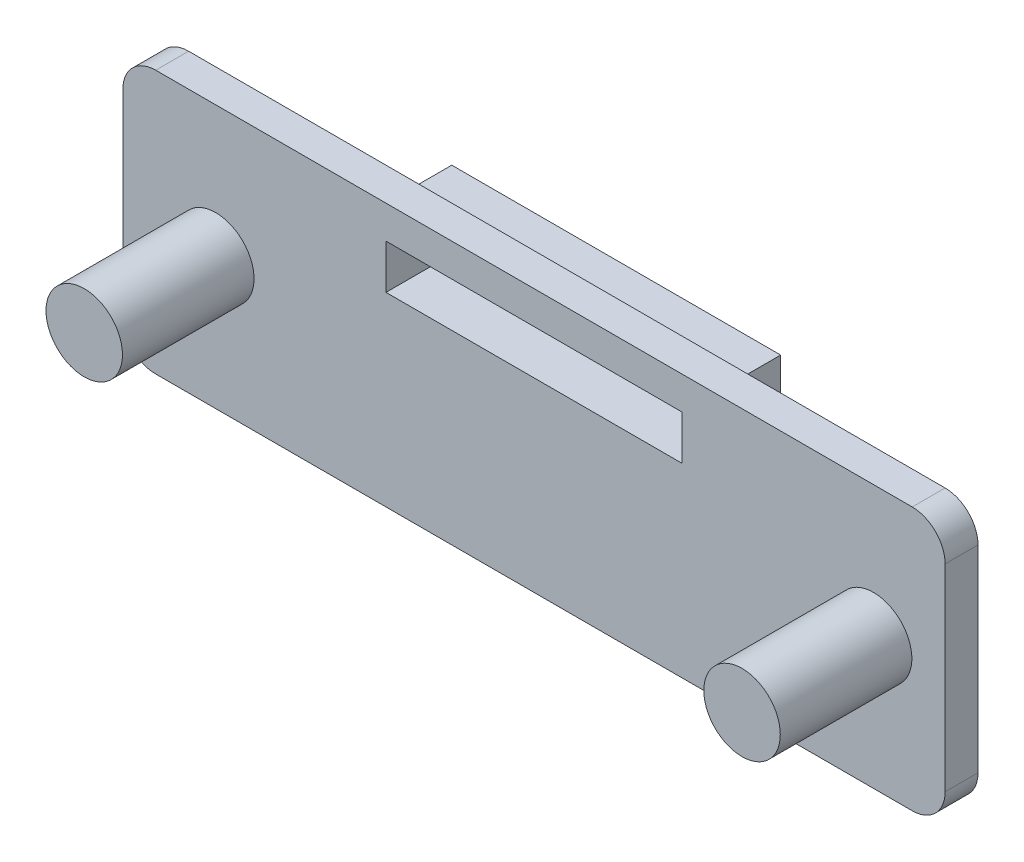
ISO-10303-21;
HEADER;
FILE_DESCRIPTION(('STEP AP214'),'2;1');
FILE_NAME('part.step','',(''),(''),'','','');
FILE_SCHEMA(('AUTOMOTIVE_DESIGN { 1 0 10303 214 1 1 1 1 }'));
ENDSEC;
DATA;
#1=APPLICATION_CONTEXT('core data for automotive mechanical design processes');
#2=APPLICATION_PROTOCOL_DEFINITION('international standard','automotive_design',2000,#1);
#3=PRODUCT_CONTEXT('',#1,'mechanical');
#4=PRODUCT('Part','Part','',(#3));
#5=PRODUCT_RELATED_PRODUCT_CATEGORY('part','',(#4));
#6=PRODUCT_DEFINITION_FORMATION('','',#4);
#7=PRODUCT_DEFINITION_CONTEXT('part definition',#1,'design');
#8=PRODUCT_DEFINITION('design','',#6,#7);
#9=PRODUCT_DEFINITION_SHAPE('','',#8);
#10=(LENGTH_UNIT() NAMED_UNIT(*) SI_UNIT(.MILLI.,.METRE.));
#11=(NAMED_UNIT(*) PLANE_ANGLE_UNIT() SI_UNIT($,.RADIAN.));
#12=(NAMED_UNIT(*) SI_UNIT($,.STERADIAN.) SOLID_ANGLE_UNIT());
#13=UNCERTAINTY_MEASURE_WITH_UNIT(LENGTH_MEASURE(1.E-05),#10,'distance_accuracy_value','');
#14=(GEOMETRIC_REPRESENTATION_CONTEXT(3) GLOBAL_UNCERTAINTY_ASSIGNED_CONTEXT((#13)) GLOBAL_UNIT_ASSIGNED_CONTEXT((#10,
#11,#12)) REPRESENTATION_CONTEXT('',''));
#15=CARTESIAN_POINT('',(0.,0.,0.));
#16=DIRECTION('',(0.,0.,1.));
#17=DIRECTION('',(1.,0.,0.));
#18=AXIS2_PLACEMENT_3D('',#15,#16,#17);
#19=CARTESIAN_POINT('',(19.6730582498255,18.1725691609462,2.));
#20=DIRECTION('',(-1.,0.,0.));
#21=DIRECTION('',(0.,-1.,0.));
#22=AXIS2_PLACEMENT_3D('',#19,#20,#21);
#23=PLANE('',#22);
#24=DIRECTION('',(0.,1.,0.));
#25=VECTOR('',#24,1.);
#26=CARTESIAN_POINT('',(19.6730582498255,18.1725691609462,0.));
#27=LINE('',#26,#25);
#28=CARTESIAN_POINT('',(19.6730582498256,4.17256916094625,0.));
#29=VERTEX_POINT('',#28);
#30=CARTESIAN_POINT('',(19.6730582498255,16.1725691609462,0.));
#31=VERTEX_POINT('',#30);
#32=EDGE_CURVE('E220',#29,#31,#27,.T.);
#33=ORIENTED_EDGE('',*,*,#32,.T.);
#34=DIRECTION('',(0.,0.,-1.));
#35=VECTOR('',#34,1.);
#36=CARTESIAN_POINT('',(19.6730582498255,16.1725691609462,2.));
#37=LINE('',#36,#35);
#38=CARTESIAN_POINT('',(19.6730582498255,16.1725691609462,2.));
#39=VERTEX_POINT('',#38);
#40=EDGE_CURVE('E266',#31,#39,#37,.F.);
#41=ORIENTED_EDGE('',*,*,#40,.T.);
#42=DIRECTION('',(0.,1.,0.));
#43=VECTOR('',#42,1.);
#44=CARTESIAN_POINT('',(19.6730582498255,18.1725691609462,2.));
#45=LINE('',#44,#43);
#46=CARTESIAN_POINT('',(19.6730582498256,4.17256916094625,2.));
#47=VERTEX_POINT('',#46);
#48=EDGE_CURVE('E221',#47,#39,#45,.T.);
#49=ORIENTED_EDGE('',*,*,#48,.F.);
#50=DIRECTION('',(0.,0.,-1.));
#51=VECTOR('',#50,1.);
#52=CARTESIAN_POINT('',(19.6730582498256,4.17256916094625,2.));
#53=LINE('',#52,#51);
#54=EDGE_CURVE('E263',#47,#29,#53,.T.);
#55=ORIENTED_EDGE('',*,*,#54,.T.);
#56=EDGE_LOOP('',(#33,#41,#49,#55));
#57=FACE_BOUND('',#56,.T.);
#58=ADVANCED_FACE('F33',(#57),#23,.F.);
#59=CARTESIAN_POINT('',(19.6730582498255,18.1725691609462,2.));
#60=DIRECTION('',(0.,-1.,0.));
#61=DIRECTION('',(0.,0.,-1.));
#62=AXIS2_PLACEMENT_3D('',#59,#60,#61);
#63=PLANE('',#62);
#64=DIRECTION('',(-1.,0.,0.));
#65=VECTOR('',#64,1.);
#66=CARTESIAN_POINT('',(19.6730582498255,18.1725691609462,2.));
#67=LINE('',#66,#65);
#68=CARTESIAN_POINT('',(17.6730582498255,18.1725691609462,2.));
#69=VERTEX_POINT('',#68);
#70=CARTESIAN_POINT('',(-28.3269417501745,18.1725691609462,2.));
#71=VERTEX_POINT('',#70);
#72=EDGE_CURVE('E224',#69,#71,#67,.T.);
#73=ORIENTED_EDGE('',*,*,#72,.F.);
#74=DIRECTION('',(0.,0.,-1.));
#75=VECTOR('',#74,1.);
#76=CARTESIAN_POINT('',(17.6730582498255,18.1725691609462,2.));
#77=LINE('',#76,#75);
#78=CARTESIAN_POINT('',(17.6730582498255,18.1725691609462,0.));
#79=VERTEX_POINT('',#78);
#80=EDGE_CURVE('E252',#69,#79,#77,.T.);
#81=ORIENTED_EDGE('',*,*,#80,.T.);
#82=DIRECTION('',(-1.,0.,0.));
#83=VECTOR('',#82,1.);
#84=CARTESIAN_POINT('',(19.6730582498255,18.1725691609462,0.));
#85=LINE('',#84,#83);
#86=CARTESIAN_POINT('',(-28.3269417501745,18.1725691609462,0.));
#87=VERTEX_POINT('',#86);
#88=EDGE_CURVE('E237',#79,#87,#85,.T.);
#89=ORIENTED_EDGE('',*,*,#88,.T.);
#90=DIRECTION('',(0.,0.,-1.));
#91=VECTOR('',#90,1.);
#92=CARTESIAN_POINT('',(-28.3269417501745,18.1725691609462,2.));
#93=LINE('',#92,#91);
#94=EDGE_CURVE('E250',#87,#71,#93,.F.);
#95=ORIENTED_EDGE('',*,*,#94,.T.);
#96=EDGE_LOOP('',(#73,#81,#89,#95));
#97=FACE_BOUND('',#96,.T.);
#98=ADVANCED_FACE('F316',(#97),#63,.F.);
#99=CARTESIAN_POINT('',(-30.3269417501745,18.1725691609462,2.));
#100=DIRECTION('',(1.,0.,0.));
#101=DIRECTION('',(0.,0.,-1.));
#102=AXIS2_PLACEMENT_3D('',#99,#100,#101);
#103=PLANE('',#102);
#104=DIRECTION('',(0.,-1.,0.));
#105=VECTOR('',#104,1.);
#106=CARTESIAN_POINT('',(-30.3269417501745,18.1725691609462,0.));
#107=LINE('',#106,#105);
#108=CARTESIAN_POINT('',(-30.3269417501745,16.1725691609462,0.));
#109=VERTEX_POINT('',#108);
#110=CARTESIAN_POINT('',(-30.3269417501745,4.17256916094624,0.));
#111=VERTEX_POINT('',#110);
#112=EDGE_CURVE('E240',#109,#111,#107,.T.);
#113=ORIENTED_EDGE('',*,*,#112,.T.);
#114=DIRECTION('',(0.,0.,-1.));
#115=VECTOR('',#114,1.);
#116=CARTESIAN_POINT('',(-30.3269417501745,4.17256916094624,2.));
#117=LINE('',#116,#115);
#118=CARTESIAN_POINT('',(-30.3269417501745,4.17256916094624,2.));
#119=VERTEX_POINT('',#118);
#120=EDGE_CURVE('E11',#111,#119,#117,.F.);
#121=ORIENTED_EDGE('',*,*,#120,.T.);
#122=DIRECTION('',(0.,-1.,0.));
#123=VECTOR('',#122,1.);
#124=CARTESIAN_POINT('',(-30.3269417501745,18.1725691609462,2.));
#125=LINE('',#124,#123);
#126=CARTESIAN_POINT('',(-30.3269417501745,16.1725691609462,2.));
#127=VERTEX_POINT('',#126);
#128=EDGE_CURVE('E228',#127,#119,#125,.T.);
#129=ORIENTED_EDGE('',*,*,#128,.F.);
#130=DIRECTION('',(0.,0.,-1.));
#131=VECTOR('',#130,1.);
#132=CARTESIAN_POINT('',(-30.3269417501745,16.1725691609462,2.));
#133=LINE('',#132,#131);
#134=EDGE_CURVE('E41',#127,#109,#133,.T.);
#135=ORIENTED_EDGE('',*,*,#134,.T.);
#136=EDGE_LOOP('',(#113,#121,#129,#135));
#137=FACE_BOUND('',#136,.T.);
#138=ADVANCED_FACE('F285',(#137),#103,.F.);
#139=CARTESIAN_POINT('',(19.6730582498256,2.17256916094625,2.));
#140=DIRECTION('',(0.,1.,0.));
#141=DIRECTION('',(-1.,0.,0.));
#142=AXIS2_PLACEMENT_3D('',#139,#140,#141);
#143=PLANE('',#142);
#144=DIRECTION('',(1.,0.,0.));
#145=VECTOR('',#144,1.);
#146=CARTESIAN_POINT('',(19.6730582498256,2.17256916094625,0.));
#147=LINE('',#146,#145);
#148=CARTESIAN_POINT('',(-28.3269417501745,2.17256916094624,0.));
#149=VERTEX_POINT('',#148);
#150=CARTESIAN_POINT('',(17.6730582498256,2.17256916094625,0.));
#151=VERTEX_POINT('',#150);
#152=EDGE_CURVE('E225',#149,#151,#147,.T.);
#153=ORIENTED_EDGE('',*,*,#152,.T.);
#154=DIRECTION('',(0.,0.,-1.));
#155=VECTOR('',#154,1.);
#156=CARTESIAN_POINT('',(17.6730582498256,2.17256916094625,2.));
#157=LINE('',#156,#155);
#158=CARTESIAN_POINT('',(17.6730582498256,2.17256916094625,2.));
#159=VERTEX_POINT('',#158);
#160=EDGE_CURVE('E279',#151,#159,#157,.F.);
#161=ORIENTED_EDGE('',*,*,#160,.T.);
#162=DIRECTION('',(1.,0.,0.));
#163=VECTOR('',#162,1.);
#164=CARTESIAN_POINT('',(19.6730582498256,2.17256916094625,2.));
#165=LINE('',#164,#163);
#166=CARTESIAN_POINT('',(-28.3269417501745,2.17256916094624,2.));
#167=VERTEX_POINT('',#166);
#168=EDGE_CURVE('E231',#167,#159,#165,.T.);
#169=ORIENTED_EDGE('',*,*,#168,.F.);
#170=DIRECTION('',(0.,0.,-1.));
#171=VECTOR('',#170,1.);
#172=CARTESIAN_POINT('',(-28.3269417501745,2.17256916094624,2.));
#173=LINE('',#172,#171);
#174=EDGE_CURVE('E276',#167,#149,#173,.T.);
#175=ORIENTED_EDGE('',*,*,#174,.T.);
#176=EDGE_LOOP('',(#153,#161,#169,#175));
#177=FACE_BOUND('',#176,.T.);
#178=ADVANCED_FACE('F299',(#177),#143,.F.);
#179=CARTESIAN_POINT('',(0.,0.,2.));
#180=DIRECTION('',(0.,0.,-1.));
#181=DIRECTION('',(-1.,0.,0.));
#182=AXIS2_PLACEMENT_3D('',#179,#180,#181);
#183=PLANE('',#182);
#184=DIRECTION('',(1.,0.,0.));
#185=VECTOR('',#184,1.);
#186=CARTESIAN_POINT('',(3.67305824982556,16.1725691609462,2.));
#187=LINE('',#186,#185);
#188=CARTESIAN_POINT('',(-14.3269417501744,16.1725691609462,2.));
#189=VERTEX_POINT('',#188);
#190=CARTESIAN_POINT('',(3.67305824982556,16.1725691609462,2.));
#191=VERTEX_POINT('',#190);
#192=EDGE_CURVE('E153',#189,#191,#187,.T.);
#193=ORIENTED_EDGE('',*,*,#192,.T.);
#194=DIRECTION('',(0.,-1.,0.));
#195=VECTOR('',#194,1.);
#196=CARTESIAN_POINT('',(3.67305824982556,16.1725691609462,2.));
#197=LINE('',#196,#195);
#198=CARTESIAN_POINT('',(3.67305824982556,13.4725691609462,2.));
#199=VERTEX_POINT('',#198);
#200=EDGE_CURVE('E147',#191,#199,#197,.T.);
#201=ORIENTED_EDGE('',*,*,#200,.T.);
#202=DIRECTION('',(-1.,0.,0.));
#203=VECTOR('',#202,1.);
#204=CARTESIAN_POINT('',(3.67305824982556,13.4725691609462,2.));
#205=LINE('',#204,#203);
#206=CARTESIAN_POINT('',(-14.3269417501744,13.4725691609462,2.));
#207=VERTEX_POINT('',#206);
#208=EDGE_CURVE('E156',#199,#207,#205,.T.);
#209=ORIENTED_EDGE('',*,*,#208,.T.);
#210=DIRECTION('',(0.,1.,0.));
#211=VECTOR('',#210,1.);
#212=CARTESIAN_POINT('',(-14.3269417501744,16.1725691609462,2.));
#213=LINE('',#212,#211);
#214=EDGE_CURVE('E48',#207,#189,#213,.T.);
#215=ORIENTED_EDGE('',*,*,#214,.T.);
#216=EDGE_LOOP('',(#193,#201,#209,#215));
#217=FACE_BOUND('',#216,.T.);
#218=CARTESIAN_POINT('',(15.3248025123997,10.1725691609462,2.));
#219=DIRECTION('',(0.,0.,-1.));
#220=DIRECTION('',(-1.,0.,0.));
#221=AXIS2_PLACEMENT_3D('',#218,#219,#220);
#222=CIRCLE('',#221,2.325);
#223=CARTESIAN_POINT('',(12.9998025123997,10.1725691609462,2.));
#224=VERTEX_POINT('',#223);
#225=EDGE_CURVE('E247',#224,#224,#222,.F.);
#226=ORIENTED_EDGE('',*,*,#225,.F.);
#227=EDGE_LOOP('',(#226));
#228=FACE_BOUND('',#227,.T.);
#229=CARTESIAN_POINT('',(-24.6751974876003,10.1725691609462,2.));
#230=DIRECTION('',(0.,0.,-1.));
#231=DIRECTION('',(-1.,0.,0.));
#232=AXIS2_PLACEMENT_3D('',#229,#230,#231);
#233=CIRCLE('',#232,2.325);
#234=CARTESIAN_POINT('',(-27.0001974876003,10.1725691609462,2.));
#235=VERTEX_POINT('',#234);
#236=EDGE_CURVE('E234',#235,#235,#233,.F.);
#237=ORIENTED_EDGE('',*,*,#236,.F.);
#238=EDGE_LOOP('',(#237));
#239=FACE_BOUND('',#238,.T.);
#240=ORIENTED_EDGE('',*,*,#48,.T.);
#241=CARTESIAN_POINT('',(17.6730582498255,16.1725691609462,2.));
#242=DIRECTION('',(0.,0.,-1.));
#243=DIRECTION('',(-1.,0.,0.));
#244=AXIS2_PLACEMENT_3D('',#241,#242,#243);
#245=CIRCLE('',#244,2.);
#246=EDGE_CURVE('E274',#39,#69,#245,.F.);
#247=ORIENTED_EDGE('',*,*,#246,.T.);
#248=ORIENTED_EDGE('',*,*,#72,.T.);
#249=CARTESIAN_POINT('',(-28.3269417501745,16.1725691609462,2.));
#250=DIRECTION('',(0.,0.,-1.));
#251=DIRECTION('',(-1.,0.,0.));
#252=AXIS2_PLACEMENT_3D('',#249,#250,#251);
#253=CIRCLE('',#252,2.);
#254=EDGE_CURVE('E268',#71,#127,#253,.F.);
#255=ORIENTED_EDGE('',*,*,#254,.T.);
#256=ORIENTED_EDGE('',*,*,#128,.T.);
#257=CARTESIAN_POINT('',(-28.3269417501745,4.17256916094624,2.));
#258=DIRECTION('',(0.,0.,-1.));
#259=DIRECTION('',(-1.,0.,0.));
#260=AXIS2_PLACEMENT_3D('',#257,#258,#259);
#261=CIRCLE('',#260,2.);
#262=EDGE_CURVE('E270',#119,#167,#261,.F.);
#263=ORIENTED_EDGE('',*,*,#262,.T.);
#264=ORIENTED_EDGE('',*,*,#168,.T.);
#265=CARTESIAN_POINT('',(17.6730582498256,4.17256916094625,2.));
#266=DIRECTION('',(0.,0.,-1.));
#267=DIRECTION('',(-1.,0.,0.));
#268=AXIS2_PLACEMENT_3D('',#265,#266,#267);
#269=CIRCLE('',#268,2.);
#270=EDGE_CURVE('E272',#159,#47,#269,.F.);
#271=ORIENTED_EDGE('',*,*,#270,.T.);
#272=EDGE_LOOP('',(#240,#247,#248,#255,#256,#263,#264,#271));
#273=FACE_BOUND('',#272,.T.);
#274=ADVANCED_FACE('F160',(#217,#228,#239,#273),#183,.F.);
#275=CARTESIAN_POINT('',(0.,0.,0.));
#276=DIRECTION('',(0.,0.,-1.));
#277=DIRECTION('',(-1.,0.,0.));
#278=AXIS2_PLACEMENT_3D('',#275,#276,#277);
#279=PLANE('',#278);
#280=DIRECTION('',(0.,-1.,0.));
#281=VECTOR('',#280,1.);
#282=CARTESIAN_POINT('',(4.67305824982556,17.1725691609462,0.));
#283=LINE('',#282,#281);
#284=CARTESIAN_POINT('',(4.67305824982556,17.1725691609462,0.));
#285=VERTEX_POINT('',#284);
#286=CARTESIAN_POINT('',(4.67305824982556,3.17256916094625,0.));
#287=VERTEX_POINT('',#286);
#288=EDGE_CURVE('E178',#285,#287,#283,.T.);
#289=ORIENTED_EDGE('',*,*,#288,.F.);
#290=DIRECTION('',(1.,0.,0.));
#291=VECTOR('',#290,1.);
#292=CARTESIAN_POINT('',(4.67305824982556,17.1725691609462,0.));
#293=LINE('',#292,#291);
#294=CARTESIAN_POINT('',(-15.3269417501744,17.1725691609462,0.));
#295=VERTEX_POINT('',#294);
#296=EDGE_CURVE('E186',#295,#285,#293,.T.);
#297=ORIENTED_EDGE('',*,*,#296,.F.);
#298=DIRECTION('',(0.,1.,0.));
#299=VECTOR('',#298,1.);
#300=CARTESIAN_POINT('',(-15.3269417501744,17.1725691609462,0.));
#301=LINE('',#300,#299);
#302=CARTESIAN_POINT('',(-15.3269417501744,3.17256916094625,0.));
#303=VERTEX_POINT('',#302);
#304=EDGE_CURVE('E198',#303,#295,#301,.T.);
#305=ORIENTED_EDGE('',*,*,#304,.F.);
#306=DIRECTION('',(-1.,0.,0.));
#307=VECTOR('',#306,1.);
#308=CARTESIAN_POINT('',(4.67305824982556,3.17256916094625,0.));
#309=LINE('',#308,#307);
#310=EDGE_CURVE('E195',#287,#303,#309,.T.);
#311=ORIENTED_EDGE('',*,*,#310,.F.);
#312=EDGE_LOOP('',(#289,#297,#305,#311));
#313=FACE_BOUND('',#312,.T.);
#314=ORIENTED_EDGE('',*,*,#88,.F.);
#315=CARTESIAN_POINT('',(17.6730582498255,16.1725691609462,0.));
#316=DIRECTION('',(0.,0.,-1.));
#317=DIRECTION('',(-1.,0.,0.));
#318=AXIS2_PLACEMENT_3D('',#315,#316,#317);
#319=CIRCLE('',#318,2.);
#320=EDGE_CURVE('E261',#79,#31,#319,.T.);
#321=ORIENTED_EDGE('',*,*,#320,.T.);
#322=ORIENTED_EDGE('',*,*,#32,.F.);
#323=CARTESIAN_POINT('',(17.6730582498256,4.17256916094625,0.));
#324=DIRECTION('',(0.,0.,-1.));
#325=DIRECTION('',(-1.,0.,0.));
#326=AXIS2_PLACEMENT_3D('',#323,#324,#325);
#327=CIRCLE('',#326,2.);
#328=EDGE_CURVE('E259',#29,#151,#327,.T.);
#329=ORIENTED_EDGE('',*,*,#328,.T.);
#330=ORIENTED_EDGE('',*,*,#152,.F.);
#331=CARTESIAN_POINT('',(-28.3269417501745,4.17256916094624,0.));
#332=DIRECTION('',(0.,0.,-1.));
#333=DIRECTION('',(-1.,0.,0.));
#334=AXIS2_PLACEMENT_3D('',#331,#332,#333);
#335=CIRCLE('',#334,2.);
#336=EDGE_CURVE('E257',#149,#111,#335,.T.);
#337=ORIENTED_EDGE('',*,*,#336,.T.);
#338=ORIENTED_EDGE('',*,*,#112,.F.);
#339=CARTESIAN_POINT('',(-28.3269417501745,16.1725691609462,0.));
#340=DIRECTION('',(0.,0.,-1.));
#341=DIRECTION('',(-1.,0.,0.));
#342=AXIS2_PLACEMENT_3D('',#339,#340,#341);
#343=CIRCLE('',#342,2.);
#344=EDGE_CURVE('E255',#109,#87,#343,.T.);
#345=ORIENTED_EDGE('',*,*,#344,.T.);
#346=EDGE_LOOP('',(#314,#321,#322,#329,#330,#337,#338,#345));
#347=FACE_BOUND('',#346,.T.);
#348=ADVANCED_FACE('F291',(#313,#347),#279,.T.);
#349=CARTESIAN_POINT('',(-24.6751974876003,10.1725691609462,10.));
#350=DIRECTION('',(0.,0.,-1.));
#351=DIRECTION('',(-1.,0.,0.));
#352=AXIS2_PLACEMENT_3D('',#349,#350,#351);
#353=CYLINDRICAL_SURFACE('',#352,2.325);
#354=CARTESIAN_POINT('',(-24.6751974876003,10.1725691609462,10.));
#355=DIRECTION('',(0.,0.,1.));
#356=DIRECTION('',(1.,0.,0.));
#357=AXIS2_PLACEMENT_3D('',#354,#355,#356);
#358=CIRCLE('',#357,2.325);
#359=CARTESIAN_POINT('',(-22.3501974876003,10.1725691609462,10.));
#360=VERTEX_POINT('',#359);
#361=EDGE_CURVE('E217',#360,#360,#358,.T.);
#362=ORIENTED_EDGE('',*,*,#361,.F.);
#363=EDGE_LOOP('',(#362));
#364=FACE_BOUND('',#363,.T.);
#365=ORIENTED_EDGE('',*,*,#236,.T.);
#366=EDGE_LOOP('',(#365));
#367=FACE_BOUND('',#366,.T.);
#368=ADVANCED_FACE('F362',(#364,#367),#353,.T.);
#369=CARTESIAN_POINT('',(-24.6751974876003,10.1725691609462,10.));
#370=DIRECTION('',(0.,0.,1.));
#371=DIRECTION('',(1.,0.,0.));
#372=AXIS2_PLACEMENT_3D('',#369,#370,#371);
#373=PLANE('',#372);
#374=ORIENTED_EDGE('',*,*,#361,.T.);
#375=EDGE_LOOP('',(#374));
#376=FACE_BOUND('',#375,.T.);
#377=ADVANCED_FACE('F464',(#376),#373,.T.);
#378=CARTESIAN_POINT('',(15.3248025123997,10.1725691609462,10.));
#379=DIRECTION('',(0.,0.,-1.));
#380=DIRECTION('',(-1.,0.,0.));
#381=AXIS2_PLACEMENT_3D('',#378,#379,#380);
#382=CYLINDRICAL_SURFACE('',#381,2.325);
#383=CARTESIAN_POINT('',(15.3248025123997,10.1725691609462,10.));
#384=DIRECTION('',(0.,0.,1.));
#385=DIRECTION('',(1.,0.,0.));
#386=AXIS2_PLACEMENT_3D('',#383,#384,#385);
#387=CIRCLE('',#386,2.325);
#388=CARTESIAN_POINT('',(17.6498025123997,10.1725691609462,10.));
#389=VERTEX_POINT('',#388);
#390=EDGE_CURVE('E214',#389,#389,#387,.T.);
#391=ORIENTED_EDGE('',*,*,#390,.F.);
#392=EDGE_LOOP('',(#391));
#393=FACE_BOUND('',#392,.T.);
#394=ORIENTED_EDGE('',*,*,#225,.T.);
#395=EDGE_LOOP('',(#394));
#396=FACE_BOUND('',#395,.T.);
#397=ADVANCED_FACE('F460',(#393,#396),#382,.T.);
#398=CARTESIAN_POINT('',(15.3248025123997,10.1725691609462,10.));
#399=DIRECTION('',(0.,0.,1.));
#400=DIRECTION('',(1.,0.,0.));
#401=AXIS2_PLACEMENT_3D('',#398,#399,#400);
#402=PLANE('',#401);
#403=ORIENTED_EDGE('',*,*,#390,.T.);
#404=EDGE_LOOP('',(#403));
#405=FACE_BOUND('',#404,.T.);
#406=ADVANCED_FACE('F337',(#405),#402,.T.);
#407=CARTESIAN_POINT('',(17.6730582498255,16.1725691609462,2.));
#408=DIRECTION('',(0.,0.,-1.));
#409=DIRECTION('',(-1.,0.,0.));
#410=AXIS2_PLACEMENT_3D('',#407,#408,#409);
#411=CYLINDRICAL_SURFACE('',#410,2.);
#412=ORIENTED_EDGE('',*,*,#246,.F.);
#413=ORIENTED_EDGE('',*,*,#40,.F.);
#414=ORIENTED_EDGE('',*,*,#320,.F.);
#415=ORIENTED_EDGE('',*,*,#80,.F.);
#416=EDGE_LOOP('',(#412,#413,#414,#415));
#417=FACE_BOUND('',#416,.T.);
#418=ADVANCED_FACE('F313',(#417),#411,.T.);
#419=CARTESIAN_POINT('',(17.6730582498256,4.17256916094625,2.));
#420=DIRECTION('',(0.,0.,-1.));
#421=DIRECTION('',(-1.,0.,0.));
#422=AXIS2_PLACEMENT_3D('',#419,#420,#421);
#423=CYLINDRICAL_SURFACE('',#422,2.);
#424=ORIENTED_EDGE('',*,*,#270,.F.);
#425=ORIENTED_EDGE('',*,*,#160,.F.);
#426=ORIENTED_EDGE('',*,*,#328,.F.);
#427=ORIENTED_EDGE('',*,*,#54,.F.);
#428=EDGE_LOOP('',(#424,#425,#426,#427));
#429=FACE_BOUND('',#428,.T.);
#430=ADVANCED_FACE('F306',(#429),#423,.T.);
#431=CARTESIAN_POINT('',(-28.3269417501745,4.17256916094624,2.));
#432=DIRECTION('',(0.,0.,-1.));
#433=DIRECTION('',(-1.,0.,0.));
#434=AXIS2_PLACEMENT_3D('',#431,#432,#433);
#435=CYLINDRICAL_SURFACE('',#434,2.);
#436=ORIENTED_EDGE('',*,*,#262,.F.);
#437=ORIENTED_EDGE('',*,*,#120,.F.);
#438=ORIENTED_EDGE('',*,*,#336,.F.);
#439=ORIENTED_EDGE('',*,*,#174,.F.);
#440=EDGE_LOOP('',(#436,#437,#438,#439));
#441=FACE_BOUND('',#440,.T.);
#442=ADVANCED_FACE('F296',(#441),#435,.T.);
#443=CARTESIAN_POINT('',(-28.3269417501745,16.1725691609462,2.));
#444=DIRECTION('',(0.,0.,-1.));
#445=DIRECTION('',(-1.,0.,0.));
#446=AXIS2_PLACEMENT_3D('',#443,#444,#445);
#447=CYLINDRICAL_SURFACE('',#446,2.);
#448=ORIENTED_EDGE('',*,*,#254,.F.);
#449=ORIENTED_EDGE('',*,*,#94,.F.);
#450=ORIENTED_EDGE('',*,*,#344,.F.);
#451=ORIENTED_EDGE('',*,*,#134,.F.);
#452=EDGE_LOOP('',(#448,#449,#450,#451));
#453=FACE_BOUND('',#452,.T.);
#454=ADVANCED_FACE('F35',(#453),#447,.T.);
#455=CARTESIAN_POINT('',(4.67305824982556,17.1725691609462,-3.));
#456=DIRECTION('',(-1.,0.,0.));
#457=DIRECTION('',(0.,0.,1.));
#458=AXIS2_PLACEMENT_3D('',#455,#456,#457);
#459=PLANE('',#458);
#460=ORIENTED_EDGE('',*,*,#288,.T.);
#461=DIRECTION('',(0.,0.,1.));
#462=VECTOR('',#461,1.);
#463=CARTESIAN_POINT('',(4.67305824982556,3.17256916094625,-3.));
#464=LINE('',#463,#462);
#465=CARTESIAN_POINT('',(4.67305824982556,3.17256916094625,-3.));
#466=VERTEX_POINT('',#465);
#467=EDGE_CURVE('E211',#466,#287,#464,.T.);
#468=ORIENTED_EDGE('',*,*,#467,.F.);
#469=DIRECTION('',(0.,-1.,0.));
#470=VECTOR('',#469,1.);
#471=CARTESIAN_POINT('',(4.67305824982556,17.1725691609462,-3.));
#472=LINE('',#471,#470);
#473=CARTESIAN_POINT('',(4.67305824982556,17.1725691609462,-3.));
#474=VERTEX_POINT('',#473);
#475=EDGE_CURVE('E182',#474,#466,#472,.T.);
#476=ORIENTED_EDGE('',*,*,#475,.F.);
#477=DIRECTION('',(0.,0.,1.));
#478=VECTOR('',#477,1.);
#479=CARTESIAN_POINT('',(4.67305824982556,17.1725691609462,-3.));
#480=LINE('',#479,#478);
#481=EDGE_CURVE('E192',#474,#285,#480,.T.);
#482=ORIENTED_EDGE('',*,*,#481,.T.);
#483=EDGE_LOOP('',(#460,#468,#476,#482));
#484=FACE_BOUND('',#483,.T.);
#485=ADVANCED_FACE('F319',(#484),#459,.F.);
#486=CARTESIAN_POINT('',(4.67305824982556,3.17256916094625,-3.));
#487=DIRECTION('',(0.,1.,0.));
#488=DIRECTION('',(-1.,0.,0.));
#489=AXIS2_PLACEMENT_3D('',#486,#487,#488);
#490=PLANE('',#489);
#491=ORIENTED_EDGE('',*,*,#310,.T.);
#492=DIRECTION('',(0.,0.,1.));
#493=VECTOR('',#492,1.);
#494=CARTESIAN_POINT('',(-15.3269417501744,3.17256916094625,-3.));
#495=LINE('',#494,#493);
#496=CARTESIAN_POINT('',(-15.3269417501744,3.17256916094625,-3.));
#497=VERTEX_POINT('',#496);
#498=EDGE_CURVE('E208',#497,#303,#495,.T.);
#499=ORIENTED_EDGE('',*,*,#498,.F.);
#500=DIRECTION('',(-1.,0.,0.));
#501=VECTOR('',#500,1.);
#502=CARTESIAN_POINT('',(4.67305824982556,3.17256916094625,-3.));
#503=LINE('',#502,#501);
#504=EDGE_CURVE('E185',#466,#497,#503,.T.);
#505=ORIENTED_EDGE('',*,*,#504,.F.);
#506=ORIENTED_EDGE('',*,*,#467,.T.);
#507=EDGE_LOOP('',(#491,#499,#505,#506));
#508=FACE_BOUND('',#507,.T.);
#509=ADVANCED_FACE('F324',(#508),#490,.F.);
#510=CARTESIAN_POINT('',(-15.3269417501744,17.1725691609462,-3.));
#511=DIRECTION('',(1.,0.,0.));
#512=DIRECTION('',(0.,0.,-1.));
#513=AXIS2_PLACEMENT_3D('',#510,#511,#512);
#514=PLANE('',#513);
#515=ORIENTED_EDGE('',*,*,#304,.T.);
#516=DIRECTION('',(0.,0.,1.));
#517=VECTOR('',#516,1.);
#518=CARTESIAN_POINT('',(-15.3269417501744,17.1725691609462,-3.));
#519=LINE('',#518,#517);
#520=CARTESIAN_POINT('',(-15.3269417501744,17.1725691609462,-3.));
#521=VERTEX_POINT('',#520);
#522=EDGE_CURVE('E205',#521,#295,#519,.T.);
#523=ORIENTED_EDGE('',*,*,#522,.F.);
#524=DIRECTION('',(0.,1.,0.));
#525=VECTOR('',#524,1.);
#526=CARTESIAN_POINT('',(-15.3269417501744,17.1725691609462,-3.));
#527=LINE('',#526,#525);
#528=EDGE_CURVE('E188',#497,#521,#527,.T.);
#529=ORIENTED_EDGE('',*,*,#528,.F.);
#530=ORIENTED_EDGE('',*,*,#498,.T.);
#531=EDGE_LOOP('',(#515,#523,#529,#530));
#532=FACE_BOUND('',#531,.T.);
#533=ADVANCED_FACE('F381',(#532),#514,.F.);
#534=CARTESIAN_POINT('',(4.67305824982556,17.1725691609462,-3.));
#535=DIRECTION('',(0.,-1.,0.));
#536=DIRECTION('',(0.,0.,-1.));
#537=AXIS2_PLACEMENT_3D('',#534,#535,#536);
#538=PLANE('',#537);
#539=ORIENTED_EDGE('',*,*,#296,.T.);
#540=ORIENTED_EDGE('',*,*,#481,.F.);
#541=DIRECTION('',(1.,0.,0.));
#542=VECTOR('',#541,1.);
#543=CARTESIAN_POINT('',(4.67305824982556,17.1725691609462,-3.));
#544=LINE('',#543,#542);
#545=EDGE_CURVE('E190',#521,#474,#544,.T.);
#546=ORIENTED_EDGE('',*,*,#545,.F.);
#547=ORIENTED_EDGE('',*,*,#522,.T.);
#548=EDGE_LOOP('',(#539,#540,#546,#547));
#549=FACE_BOUND('',#548,.T.);
#550=ADVANCED_FACE('F391',(#549),#538,.F.);
#551=CARTESIAN_POINT('',(0.,0.,-3.));
#552=DIRECTION('',(0.,0.,-1.));
#553=DIRECTION('',(-1.,0.,0.));
#554=AXIS2_PLACEMENT_3D('',#551,#552,#553);
#555=PLANE('',#554);
#556=DIRECTION('',(0.,-1.,0.));
#557=VECTOR('',#556,1.);
#558=CARTESIAN_POINT('',(3.67305824982556,16.1725691609462,-3.));
#559=LINE('',#558,#557);
#560=CARTESIAN_POINT('',(3.67305824982556,16.1725691609462,-3.));
#561=VERTEX_POINT('',#560);
#562=CARTESIAN_POINT('',(3.67305824982556,13.4725691609462,-3.));
#563=VERTEX_POINT('',#562);
#564=EDGE_CURVE('E56',#561,#563,#559,.T.);
#565=ORIENTED_EDGE('',*,*,#564,.F.);
#566=DIRECTION('',(1.,0.,0.));
#567=VECTOR('',#566,1.);
#568=CARTESIAN_POINT('',(3.67305824982556,16.1725691609462,-3.));
#569=LINE('',#568,#567);
#570=CARTESIAN_POINT('',(-14.3269417501744,16.1725691609462,-3.));
#571=VERTEX_POINT('',#570);
#572=EDGE_CURVE('E163',#571,#561,#569,.T.);
#573=ORIENTED_EDGE('',*,*,#572,.F.);
#574=DIRECTION('',(0.,1.,0.));
#575=VECTOR('',#574,1.);
#576=CARTESIAN_POINT('',(-14.3269417501744,16.1725691609462,-3.));
#577=LINE('',#576,#575);
#578=CARTESIAN_POINT('',(-14.3269417501744,13.4725691609462,-3.));
#579=VERTEX_POINT('',#578);
#580=EDGE_CURVE('E166',#579,#571,#577,.T.);
#581=ORIENTED_EDGE('',*,*,#580,.F.);
#582=DIRECTION('',(-1.,0.,0.));
#583=VECTOR('',#582,1.);
#584=CARTESIAN_POINT('',(3.67305824982556,13.4725691609462,-3.));
#585=LINE('',#584,#583);
#586=EDGE_CURVE('E172',#563,#579,#585,.T.);
#587=ORIENTED_EDGE('',*,*,#586,.F.);
#588=EDGE_LOOP('',(#565,#573,#581,#587));
#589=FACE_BOUND('',#588,.T.);
#590=ORIENTED_EDGE('',*,*,#475,.T.);
#591=ORIENTED_EDGE('',*,*,#504,.T.);
#592=ORIENTED_EDGE('',*,*,#528,.T.);
#593=ORIENTED_EDGE('',*,*,#545,.T.);
#594=EDGE_LOOP('',(#590,#591,#592,#593));
#595=FACE_BOUND('',#594,.T.);
#596=ADVANCED_FACE('F401',(#589,#595),#555,.T.);
#597=CARTESIAN_POINT('',(3.67305824982556,16.1725691609462,2.));
#598=DIRECTION('',(1.,0.,0.));
#599=DIRECTION('',(0.,1.,0.));
#600=AXIS2_PLACEMENT_3D('',#597,#598,#599);
#601=PLANE('',#600);
#602=ORIENTED_EDGE('',*,*,#564,.T.);
#603=DIRECTION('',(0.,0.,-1.));
#604=VECTOR('',#603,1.);
#605=CARTESIAN_POINT('',(3.67305824982556,13.4725691609462,2.));
#606=LINE('',#605,#604);
#607=EDGE_CURVE('E143',#199,#563,#606,.T.);
#608=ORIENTED_EDGE('',*,*,#607,.F.);
#609=ORIENTED_EDGE('',*,*,#200,.F.);
#610=DIRECTION('',(0.,0.,-1.));
#611=VECTOR('',#610,1.);
#612=CARTESIAN_POINT('',(3.67305824982556,16.1725691609462,2.));
#613=LINE('',#612,#611);
#614=EDGE_CURVE('E176',#191,#561,#613,.T.);
#615=ORIENTED_EDGE('',*,*,#614,.T.);
#616=EDGE_LOOP('',(#602,#608,#609,#615));
#617=FACE_BOUND('',#616,.T.);
#618=ADVANCED_FACE('F145',(#617),#601,.F.);
#619=CARTESIAN_POINT('',(3.67305824982556,16.1725691609462,2.));
#620=DIRECTION('',(0.,1.,0.));
#621=DIRECTION('',(0.,0.,1.));
#622=AXIS2_PLACEMENT_3D('',#619,#620,#621);
#623=PLANE('',#622);
#624=ORIENTED_EDGE('',*,*,#572,.T.);
#625=ORIENTED_EDGE('',*,*,#614,.F.);
#626=ORIENTED_EDGE('',*,*,#192,.F.);
#627=DIRECTION('',(0.,0.,-1.));
#628=VECTOR('',#627,1.);
#629=CARTESIAN_POINT('',(-14.3269417501744,16.1725691609462,2.));
#630=LINE('',#629,#628);
#631=EDGE_CURVE('E179',#189,#571,#630,.T.);
#632=ORIENTED_EDGE('',*,*,#631,.T.);
#633=EDGE_LOOP('',(#624,#625,#626,#632));
#634=FACE_BOUND('',#633,.T.);
#635=ADVANCED_FACE('F428',(#634),#623,.F.);
#636=CARTESIAN_POINT('',(-14.3269417501744,16.1725691609462,2.));
#637=DIRECTION('',(-1.,0.,0.));
#638=DIRECTION('',(0.,0.,1.));
#639=AXIS2_PLACEMENT_3D('',#636,#637,#638);
#640=PLANE('',#639);
#641=ORIENTED_EDGE('',*,*,#580,.T.);
#642=ORIENTED_EDGE('',*,*,#631,.F.);
#643=ORIENTED_EDGE('',*,*,#214,.F.);
#644=DIRECTION('',(0.,0.,-1.));
#645=VECTOR('',#644,1.);
#646=CARTESIAN_POINT('',(-14.3269417501744,13.4725691609462,2.));
#647=LINE('',#646,#645);
#648=EDGE_CURVE('E152',#207,#579,#647,.T.);
#649=ORIENTED_EDGE('',*,*,#648,.T.);
#650=EDGE_LOOP('',(#641,#642,#643,#649));
#651=FACE_BOUND('',#650,.T.);
#652=ADVANCED_FACE('F437',(#651),#640,.F.);
#653=CARTESIAN_POINT('',(3.67305824982556,13.4725691609462,2.));
#654=DIRECTION('',(0.,-1.,0.));
#655=DIRECTION('',(0.,0.,-1.));
#656=AXIS2_PLACEMENT_3D('',#653,#654,#655);
#657=PLANE('',#656);
#658=ORIENTED_EDGE('',*,*,#586,.T.);
#659=ORIENTED_EDGE('',*,*,#648,.F.);
#660=ORIENTED_EDGE('',*,*,#208,.F.);
#661=ORIENTED_EDGE('',*,*,#607,.T.);
#662=EDGE_LOOP('',(#658,#659,#660,#661));
#663=FACE_BOUND('',#662,.T.);
#664=ADVANCED_FACE('F157',(#663),#657,.F.);
#665=CLOSED_SHELL('',(#58,#98,#138,#178,#274,#348,#368,#377,#397,#406,#418,#430,#442,#454,#485,
#509,#533,#550,#596,#618,#635,#652,#664));
#666=MANIFOLD_SOLID_BREP('B2',#665);
#667=ADVANCED_BREP_SHAPE_REPRESENTATION('',(#18,#666),#14);
#668=SHAPE_DEFINITION_REPRESENTATION(#9,#667);
ENDSEC;
END-ISO-10303-21;
